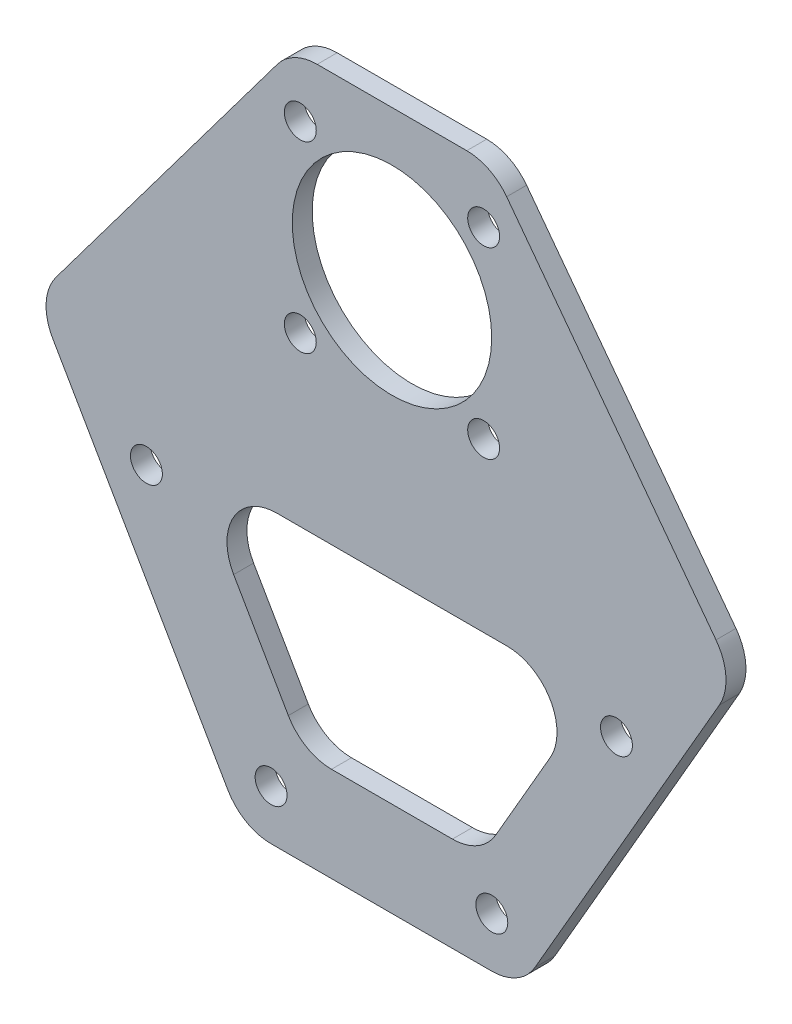
ISO-10303-21;
HEADER;
FILE_DESCRIPTION(('STEP AP214'),'2;1');
FILE_NAME('part.step','',(''),(''),'','','');
FILE_SCHEMA(('AUTOMOTIVE_DESIGN { 1 0 10303 214 1 1 1 1 }'));
ENDSEC;
DATA;
#1=APPLICATION_CONTEXT('core data for automotive mechanical design processes');
#2=APPLICATION_PROTOCOL_DEFINITION('international standard','automotive_design',2000,#1);
#3=PRODUCT_CONTEXT('',#1,'mechanical');
#4=PRODUCT('Part','Part','',(#3));
#5=PRODUCT_RELATED_PRODUCT_CATEGORY('part','',(#4));
#6=PRODUCT_DEFINITION_FORMATION('','',#4);
#7=PRODUCT_DEFINITION_CONTEXT('part definition',#1,'design');
#8=PRODUCT_DEFINITION('design','',#6,#7);
#9=PRODUCT_DEFINITION_SHAPE('','',#8);
#10=(LENGTH_UNIT() NAMED_UNIT(*) SI_UNIT(.MILLI.,.METRE.));
#11=(NAMED_UNIT(*) PLANE_ANGLE_UNIT() SI_UNIT($,.RADIAN.));
#12=(NAMED_UNIT(*) SI_UNIT($,.STERADIAN.) SOLID_ANGLE_UNIT());
#13=UNCERTAINTY_MEASURE_WITH_UNIT(LENGTH_MEASURE(1.E-05),#10,'distance_accuracy_value','');
#14=(GEOMETRIC_REPRESENTATION_CONTEXT(3) GLOBAL_UNCERTAINTY_ASSIGNED_CONTEXT((#13)) GLOBAL_UNIT_ASSIGNED_CONTEXT((#10,
#11,#12)) REPRESENTATION_CONTEXT('',''));
#15=CARTESIAN_POINT('',(0.,0.,0.));
#16=DIRECTION('',(0.,0.,1.));
#17=DIRECTION('',(1.,0.,0.));
#18=AXIS2_PLACEMENT_3D('',#15,#16,#17);
#19=CARTESIAN_POINT('',(24.828838324867,-14.3349364905276,2.));
#20=DIRECTION('',(0.866025403784439,-0.5,0.));
#21=DIRECTION('',(0.5,0.866025403784439,0.));
#22=AXIS2_PLACEMENT_3D('',#19,#20,#21);
#23=PLANE('',#22);
#24=DIRECTION('',(-0.5,-0.866025403784439,0.));
#25=VECTOR('',#24,1.);
#26=CARTESIAN_POINT('',(24.828838324867,-14.3349364905276,2.));
#27=LINE('',#26,#25);
#28=CARTESIAN_POINT('',(32.8223948546932,-0.489690447694644,2.));
#29=VERTEX_POINT('',#28);
#30=CARTESIAN_POINT('',(14.3412340178265,-32.5,2.));
#31=VERTEX_POINT('',#30);
#32=EDGE_CURVE('E245',#29,#31,#27,.T.);
#33=ORIENTED_EDGE('',*,*,#32,.T.);
#34=DIRECTION('',(0.,0.,-1.));
#35=VECTOR('',#34,1.);
#36=CARTESIAN_POINT('',(14.3412340178265,-32.5,0.));
#37=LINE('',#36,#35);
#38=CARTESIAN_POINT('',(14.3412340178265,-32.5,0.));
#39=VERTEX_POINT('',#38);
#40=EDGE_CURVE('E374',#31,#39,#37,.T.);
#41=ORIENTED_EDGE('',*,*,#40,.T.);
#42=DIRECTION('',(-0.5,-0.866025403784439,0.));
#43=VECTOR('',#42,1.);
#44=CARTESIAN_POINT('',(24.828838324867,-14.3349364905276,0.));
#45=LINE('',#44,#43);
#46=CARTESIAN_POINT('',(32.8223948546932,-0.489690447694644,0.));
#47=VERTEX_POINT('',#46);
#48=EDGE_CURVE('E311',#47,#39,#45,.T.);
#49=ORIENTED_EDGE('',*,*,#48,.F.);
#50=DIRECTION('',(0.,0.,-1.));
#51=VECTOR('',#50,1.);
#52=CARTESIAN_POINT('',(32.8223948546932,-0.48969044769465,2.));
#53=LINE('',#52,#51);
#54=EDGE_CURVE('E372',#47,#29,#53,.F.);
#55=ORIENTED_EDGE('',*,*,#54,.T.);
#56=EDGE_LOOP('',(#33,#41,#49,#55));
#57=FACE_BOUND('',#56,.T.);
#58=ADVANCED_FACE('F36',(#57),#23,.T.);
#59=CARTESIAN_POINT('',(23.2,17.4,2.));
#60=DIRECTION('',(0.8,0.6,0.));
#61=DIRECTION('',(-0.6,0.8,0.));
#62=AXIS2_PLACEMENT_3D('',#59,#60,#61);
#63=PLANE('',#62);
#64=DIRECTION('',(0.6,-0.8,0.));
#65=VECTOR('',#64,1.);
#66=CARTESIAN_POINT('',(23.2,17.4,2.));
#67=LINE('',#66,#65);
#68=CARTESIAN_POINT('',(11.5,33.,2.));
#69=VERTEX_POINT('',#68);
#70=CARTESIAN_POINT('',(32.492267835771,5.01030955230535,2.));
#71=VERTEX_POINT('',#70);
#72=EDGE_CURVE('E248',#69,#71,#67,.T.);
#73=ORIENTED_EDGE('',*,*,#72,.T.);
#74=DIRECTION('',(0.,0.,-1.));
#75=VECTOR('',#74,1.);
#76=CARTESIAN_POINT('',(32.492267835771,5.01030955230535,2.));
#77=LINE('',#76,#75);
#78=CARTESIAN_POINT('',(32.492267835771,5.01030955230535,0.));
#79=VERTEX_POINT('',#78);
#80=EDGE_CURVE('E379',#71,#79,#77,.T.);
#81=ORIENTED_EDGE('',*,*,#80,.T.);
#82=DIRECTION('',(0.6,-0.8,0.));
#83=VECTOR('',#82,1.);
#84=CARTESIAN_POINT('',(23.2,17.4,0.));
#85=LINE('',#84,#83);
#86=CARTESIAN_POINT('',(11.5,33.,0.));
#87=VERTEX_POINT('',#86);
#88=EDGE_CURVE('E314',#87,#79,#85,.T.);
#89=ORIENTED_EDGE('',*,*,#88,.F.);
#90=DIRECTION('',(0.,0.,-1.));
#91=VECTOR('',#90,1.);
#92=CARTESIAN_POINT('',(11.5,33.,2.));
#93=LINE('',#92,#91);
#94=EDGE_CURVE('E377',#87,#69,#93,.F.);
#95=ORIENTED_EDGE('',*,*,#94,.T.);
#96=EDGE_LOOP('',(#73,#81,#89,#95));
#97=FACE_BOUND('',#96,.T.);
#98=ADVANCED_FACE('F430',(#97),#63,.T.);
#99=CARTESIAN_POINT('',(0.,35.,2.));
#100=DIRECTION('',(0.,1.,0.));
#101=DIRECTION('',(0.,0.,1.));
#102=AXIS2_PLACEMENT_3D('',#99,#100,#101);
#103=PLANE('',#102);
#104=DIRECTION('',(1.,0.,0.));
#105=VECTOR('',#104,1.);
#106=CARTESIAN_POINT('',(0.,35.,2.));
#107=LINE('',#106,#105);
#108=CARTESIAN_POINT('',(-7.50000000000001,35.,2.));
#109=VERTEX_POINT('',#108);
#110=CARTESIAN_POINT('',(7.5,35.,2.));
#111=VERTEX_POINT('',#110);
#112=EDGE_CURVE('E251',#109,#111,#107,.T.);
#113=ORIENTED_EDGE('',*,*,#112,.T.);
#114=DIRECTION('',(0.,0.,-1.));
#115=VECTOR('',#114,1.);
#116=CARTESIAN_POINT('',(7.5,35.,2.));
#117=LINE('',#116,#115);
#118=CARTESIAN_POINT('',(7.5,35.,0.));
#119=VERTEX_POINT('',#118);
#120=EDGE_CURVE('E384',#111,#119,#117,.T.);
#121=ORIENTED_EDGE('',*,*,#120,.T.);
#122=DIRECTION('',(1.,0.,0.));
#123=VECTOR('',#122,1.);
#124=CARTESIAN_POINT('',(0.,35.,0.));
#125=LINE('',#124,#123);
#126=CARTESIAN_POINT('',(-7.50000000000001,35.,0.));
#127=VERTEX_POINT('',#126);
#128=EDGE_CURVE('E317',#127,#119,#125,.T.);
#129=ORIENTED_EDGE('',*,*,#128,.F.);
#130=DIRECTION('',(0.,0.,-1.));
#131=VECTOR('',#130,1.);
#132=CARTESIAN_POINT('',(-7.50000000000001,35.,2.));
#133=LINE('',#132,#131);
#134=EDGE_CURVE('E382',#127,#109,#133,.F.);
#135=ORIENTED_EDGE('',*,*,#134,.T.);
#136=EDGE_LOOP('',(#113,#121,#129,#135));
#137=FACE_BOUND('',#136,.T.);
#138=ADVANCED_FACE('F389',(#137),#103,.T.);
#139=CARTESIAN_POINT('',(-23.2,17.4,2.));
#140=DIRECTION('',(-0.8,0.6,0.));
#141=DIRECTION('',(-0.6,-0.8,0.));
#142=AXIS2_PLACEMENT_3D('',#139,#140,#141);
#143=PLANE('',#142);
#144=DIRECTION('',(0.6,0.8,0.));
#145=VECTOR('',#144,1.);
#146=CARTESIAN_POINT('',(-23.2,17.4,2.));
#147=LINE('',#146,#145);
#148=CARTESIAN_POINT('',(-33.6863283090029,3.4182289213295,2.));
#149=VERTEX_POINT('',#148);
#150=CARTESIAN_POINT('',(-11.5,33.,2.));
#151=VERTEX_POINT('',#150);
#152=EDGE_CURVE('E254',#149,#151,#147,.T.);
#153=ORIENTED_EDGE('',*,*,#152,.T.);
#154=DIRECTION('',(0.,0.,-1.));
#155=VECTOR('',#154,1.);
#156=CARTESIAN_POINT('',(-11.5,33.,2.));
#157=LINE('',#156,#155);
#158=CARTESIAN_POINT('',(-11.5,33.,0.));
#159=VERTEX_POINT('',#158);
#160=EDGE_CURVE('E11',#151,#159,#157,.T.);
#161=ORIENTED_EDGE('',*,*,#160,.T.);
#162=DIRECTION('',(0.6,0.8,0.));
#163=VECTOR('',#162,1.);
#164=CARTESIAN_POINT('',(-23.2,17.4,0.));
#165=LINE('',#164,#163);
#166=CARTESIAN_POINT('',(-33.6863283090029,3.4182289213295,0.));
#167=VERTEX_POINT('',#166);
#168=EDGE_CURVE('E320',#167,#159,#165,.T.);
#169=ORIENTED_EDGE('',*,*,#168,.F.);
#170=DIRECTION('',(0.,0.,-1.));
#171=VECTOR('',#170,1.);
#172=CARTESIAN_POINT('',(-33.6863283090029,3.4182289213295,2.));
#173=LINE('',#172,#171);
#174=EDGE_CURVE('E44',#167,#149,#173,.F.);
#175=ORIENTED_EDGE('',*,*,#174,.T.);
#176=EDGE_LOOP('',(#153,#161,#169,#175));
#177=FACE_BOUND('',#176,.T.);
#178=ADVANCED_FACE('F400',(#177),#143,.T.);
#179=CARTESIAN_POINT('',(-26.4137748154416,-15.2500000000074,2.));
#180=DIRECTION('',(-0.866025403784467,-0.499999999999951,0.));
#181=DIRECTION('',(0.499999999999951,-0.866025403784467,0.));
#182=AXIS2_PLACEMENT_3D('',#179,#180,#181);
#183=PLANE('',#182);
#184=DIRECTION('',(-0.499999999999951,0.866025403784467,0.));
#185=VECTOR('',#184,1.);
#186=CARTESIAN_POINT('',(-26.4137748154416,-15.2500000000074,0.));
#187=LINE('',#186,#185);
#188=CARTESIAN_POINT('',(-16.4544826719262,-32.4999999999998,0.));
#189=VERTEX_POINT('',#188);
#190=CARTESIAN_POINT('',(-34.0164553279252,-2.08177107867025,0.));
#191=VERTEX_POINT('',#190);
#192=EDGE_CURVE('E323',#189,#191,#187,.T.);
#193=ORIENTED_EDGE('',*,*,#192,.F.);
#194=DIRECTION('',(0.,0.,-1.));
#195=VECTOR('',#194,1.);
#196=CARTESIAN_POINT('',(-16.4544826719262,-32.4999999999998,2.));
#197=LINE('',#196,#195);
#198=CARTESIAN_POINT('',(-16.4544826719262,-32.4999999999998,2.));
#199=VERTEX_POINT('',#198);
#200=EDGE_CURVE('E359',#189,#199,#197,.F.);
#201=ORIENTED_EDGE('',*,*,#200,.T.);
#202=DIRECTION('',(-0.499999999999951,0.866025403784467,0.));
#203=VECTOR('',#202,1.);
#204=CARTESIAN_POINT('',(-26.4137748154416,-15.2500000000074,2.));
#205=LINE('',#204,#203);
#206=CARTESIAN_POINT('',(-34.0164553279252,-2.08177107867025,2.));
#207=VERTEX_POINT('',#206);
#208=EDGE_CURVE('E256',#199,#207,#205,.T.);
#209=ORIENTED_EDGE('',*,*,#208,.T.);
#210=DIRECTION('',(0.,0.,-1.));
#211=VECTOR('',#210,1.);
#212=CARTESIAN_POINT('',(-34.0164553279252,-2.08177107867025,2.));
#213=LINE('',#212,#211);
#214=EDGE_CURVE('E356',#207,#191,#213,.T.);
#215=ORIENTED_EDGE('',*,*,#214,.T.);
#216=EDGE_LOOP('',(#193,#201,#209,#215));
#217=FACE_BOUND('',#216,.T.);
#218=ADVANCED_FACE('F407',(#217),#183,.T.);
#219=CARTESIAN_POINT('',(-6.06217782649132,-20.5000000000001,2.));
#220=DIRECTION('',(0.,0.,-1.));
#221=DIRECTION('',(-1.,0.,0.));
#222=AXIS2_PLACEMENT_3D('',#219,#220,#221);
#223=CYLINDRICAL_SURFACE('',#222,5.);
#224=CARTESIAN_POINT('',(-6.06217782649132,-20.5000000000001,0.));
#225=DIRECTION('',(0.,0.,1.));
#226=DIRECTION('',(1.,0.,0.));
#227=AXIS2_PLACEMENT_3D('',#224,#225,#226);
#228=CIRCLE('',#227,5.);
#229=CARTESIAN_POINT('',(-10.3923048454135,-23.0000000000001,0.));
#230=VERTEX_POINT('',#229);
#231=CARTESIAN_POINT('',(-6.06217782649133,-25.5000000000001,0.));
#232=VERTEX_POINT('',#231);
#233=EDGE_CURVE('E180',#230,#232,#228,.T.);
#234=ORIENTED_EDGE('',*,*,#233,.F.);
#235=DIRECTION('',(0.,0.,-1.));
#236=VECTOR('',#235,1.);
#237=CARTESIAN_POINT('',(-10.3923048454135,-23.0000000000001,2.));
#238=LINE('',#237,#236);
#239=CARTESIAN_POINT('',(-10.3923048454135,-23.0000000000001,2.));
#240=VERTEX_POINT('',#239);
#241=EDGE_CURVE('E174',#240,#230,#238,.T.);
#242=ORIENTED_EDGE('',*,*,#241,.F.);
#243=CARTESIAN_POINT('',(-6.06217782649132,-20.5000000000001,2.));
#244=DIRECTION('',(0.,0.,1.));
#245=DIRECTION('',(1.,0.,0.));
#246=AXIS2_PLACEMENT_3D('',#243,#244,#245);
#247=CIRCLE('',#246,5.);
#248=CARTESIAN_POINT('',(-6.06217782649133,-25.5000000000001,2.));
#249=VERTEX_POINT('',#248);
#250=EDGE_CURVE('E177',#240,#249,#247,.T.);
#251=ORIENTED_EDGE('',*,*,#250,.T.);
#252=DIRECTION('',(0.,0.,-1.));
#253=VECTOR('',#252,1.);
#254=CARTESIAN_POINT('',(-6.06217782649133,-25.5000000000001,2.));
#255=LINE('',#254,#253);
#256=EDGE_CURVE('E262',#249,#232,#255,.T.);
#257=ORIENTED_EDGE('',*,*,#256,.T.);
#258=EDGE_LOOP('',(#234,#242,#251,#257));
#259=FACE_BOUND('',#258,.T.);
#260=ADVANCED_FACE('F176',(#259),#223,.F.);
#261=CARTESIAN_POINT('',(-17.7535207775812,-10.2500000000001,2.));
#262=DIRECTION('',(0.86602540378444,0.499999999999998,0.));
#263=DIRECTION('',(-0.499999999999998,0.86602540378444,0.));
#264=AXIS2_PLACEMENT_3D('',#261,#262,#263);
#265=PLANE('',#264);
#266=DIRECTION('',(0.499999999999998,-0.86602540378444,0.));
#267=VECTOR('',#266,1.);
#268=CARTESIAN_POINT('',(-17.7535207775812,-10.2500000000001,0.));
#269=LINE('',#268,#267);
#270=CARTESIAN_POINT('',(-15.8771324027149,-13.5000000000001,0.));
#271=VERTEX_POINT('',#270);
#272=EDGE_CURVE('E264',#271,#230,#269,.T.);
#273=ORIENTED_EDGE('',*,*,#272,.F.);
#274=DIRECTION('',(0.,0.,-1.));
#275=VECTOR('',#274,1.);
#276=CARTESIAN_POINT('',(-15.8771324027149,-13.5000000000001,2.));
#277=LINE('',#276,#275);
#278=CARTESIAN_POINT('',(-15.8771324027149,-13.5000000000001,2.));
#279=VERTEX_POINT('',#278);
#280=EDGE_CURVE('E186',#279,#271,#277,.T.);
#281=ORIENTED_EDGE('',*,*,#280,.F.);
#282=DIRECTION('',(0.499999999999998,-0.86602540378444,0.));
#283=VECTOR('',#282,1.);
#284=CARTESIAN_POINT('',(-17.7535207775812,-10.2500000000001,2.));
#285=LINE('',#284,#283);
#286=EDGE_CURVE('E193',#279,#240,#285,.T.);
#287=ORIENTED_EDGE('',*,*,#286,.T.);
#288=ORIENTED_EDGE('',*,*,#241,.T.);
#289=EDGE_LOOP('',(#273,#281,#287,#288));
#290=FACE_BOUND('',#289,.T.);
#291=ADVANCED_FACE('F200',(#290),#265,.T.);
#292=CARTESIAN_POINT('',(-11.5470053837927,-11.0000000000001,2.));
#293=DIRECTION('',(0.,0.,-1.));
#294=DIRECTION('',(-1.,0.,0.));
#295=AXIS2_PLACEMENT_3D('',#292,#293,#294);
#296=CYLINDRICAL_SURFACE('',#295,5.);
#297=CARTESIAN_POINT('',(-11.5470053837927,-11.0000000000001,0.));
#298=DIRECTION('',(0.,0.,1.));
#299=DIRECTION('',(1.,0.,0.));
#300=AXIS2_PLACEMENT_3D('',#297,#298,#299);
#301=CIRCLE('',#300,5.);
#302=CARTESIAN_POINT('',(-11.5470053837927,-6.00000000000013,0.));
#303=VERTEX_POINT('',#302);
#304=EDGE_CURVE('E266',#303,#271,#301,.T.);
#305=ORIENTED_EDGE('',*,*,#304,.F.);
#306=DIRECTION('',(0.,0.,-1.));
#307=VECTOR('',#306,1.);
#308=CARTESIAN_POINT('',(-11.5470053837927,-6.00000000000013,2.));
#309=LINE('',#308,#307);
#310=CARTESIAN_POINT('',(-11.5470053837927,-6.00000000000013,2.));
#311=VERTEX_POINT('',#310);
#312=EDGE_CURVE('E337',#311,#303,#309,.T.);
#313=ORIENTED_EDGE('',*,*,#312,.F.);
#314=CARTESIAN_POINT('',(-11.5470053837927,-11.0000000000001,2.));
#315=DIRECTION('',(0.,0.,1.));
#316=DIRECTION('',(1.,0.,0.));
#317=AXIS2_PLACEMENT_3D('',#314,#315,#316);
#318=CIRCLE('',#317,5.);
#319=EDGE_CURVE('E201',#311,#279,#318,.T.);
#320=ORIENTED_EDGE('',*,*,#319,.T.);
#321=ORIENTED_EDGE('',*,*,#280,.T.);
#322=EDGE_LOOP('',(#305,#313,#320,#321));
#323=FACE_BOUND('',#322,.T.);
#324=ADVANCED_FACE('F504',(#323),#296,.F.);
#325=CARTESIAN_POINT('',(0.,-6.00000000000016,2.));
#326=DIRECTION('',(0.,-1.,0.));
#327=DIRECTION('',(1.,0.,0.));
#328=AXIS2_PLACEMENT_3D('',#325,#326,#327);
#329=PLANE('',#328);
#330=DIRECTION('',(-1.,0.,0.));
#331=VECTOR('',#330,1.);
#332=CARTESIAN_POINT('',(0.,-6.00000000000016,0.));
#333=LINE('',#332,#331);
#334=CARTESIAN_POINT('',(11.5470053837923,-6.00000000000018,0.));
#335=VERTEX_POINT('',#334);
#336=EDGE_CURVE('E269',#335,#303,#333,.T.);
#337=ORIENTED_EDGE('',*,*,#336,.F.);
#338=DIRECTION('',(0.,0.,-1.));
#339=VECTOR('',#338,1.);
#340=CARTESIAN_POINT('',(11.5470053837923,-6.00000000000018,2.));
#341=LINE('',#340,#339);
#342=CARTESIAN_POINT('',(11.5470053837923,-6.00000000000018,2.));
#343=VERTEX_POINT('',#342);
#344=EDGE_CURVE('E335',#343,#335,#341,.T.);
#345=ORIENTED_EDGE('',*,*,#344,.F.);
#346=DIRECTION('',(-1.,0.,0.));
#347=VECTOR('',#346,1.);
#348=CARTESIAN_POINT('',(0.,-6.00000000000016,2.));
#349=LINE('',#348,#347);
#350=EDGE_CURVE('E203',#343,#311,#349,.T.);
#351=ORIENTED_EDGE('',*,*,#350,.T.);
#352=ORIENTED_EDGE('',*,*,#312,.T.);
#353=EDGE_LOOP('',(#337,#345,#351,#352));
#354=FACE_BOUND('',#353,.T.);
#355=ADVANCED_FACE('F500',(#354),#329,.T.);
#356=CARTESIAN_POINT('',(11.5470053837923,-11.0000000000002,2.));
#357=DIRECTION('',(0.,0.,-1.));
#358=DIRECTION('',(-1.,0.,0.));
#359=AXIS2_PLACEMENT_3D('',#356,#357,#358);
#360=CYLINDRICAL_SURFACE('',#359,5.);
#361=CARTESIAN_POINT('',(11.5470053837923,-11.0000000000002,0.));
#362=DIRECTION('',(0.,0.,1.));
#363=DIRECTION('',(1.,0.,0.));
#364=AXIS2_PLACEMENT_3D('',#361,#362,#363);
#365=CIRCLE('',#364,5.);
#366=CARTESIAN_POINT('',(15.8771324027145,-13.5000000000002,0.));
#367=VERTEX_POINT('',#366);
#368=EDGE_CURVE('E272',#367,#335,#365,.T.);
#369=ORIENTED_EDGE('',*,*,#368,.F.);
#370=DIRECTION('',(0.,0.,-1.));
#371=VECTOR('',#370,1.);
#372=CARTESIAN_POINT('',(15.8771324027145,-13.5000000000002,2.));
#373=LINE('',#372,#371);
#374=CARTESIAN_POINT('',(15.8771324027145,-13.5000000000002,2.));
#375=VERTEX_POINT('',#374);
#376=EDGE_CURVE('E333',#375,#367,#373,.T.);
#377=ORIENTED_EDGE('',*,*,#376,.F.);
#378=CARTESIAN_POINT('',(11.5470053837923,-11.0000000000002,2.));
#379=DIRECTION('',(0.,0.,1.));
#380=DIRECTION('',(1.,0.,0.));
#381=AXIS2_PLACEMENT_3D('',#378,#379,#380);
#382=CIRCLE('',#381,5.);
#383=EDGE_CURVE('E208',#375,#343,#382,.T.);
#384=ORIENTED_EDGE('',*,*,#383,.T.);
#385=ORIENTED_EDGE('',*,*,#344,.T.);
#386=EDGE_LOOP('',(#369,#377,#384,#385));
#387=FACE_BOUND('',#386,.T.);
#388=ADVANCED_FACE('F496',(#387),#360,.F.);
#389=CARTESIAN_POINT('',(17.7535207775809,-10.25,2.));
#390=DIRECTION('',(-0.866025403784438,0.500000000000002,0.));
#391=DIRECTION('',(-0.500000000000002,-0.866025403784438,0.));
#392=AXIS2_PLACEMENT_3D('',#389,#390,#391);
#393=PLANE('',#392);
#394=DIRECTION('',(0.500000000000002,0.866025403784438,0.));
#395=VECTOR('',#394,1.);
#396=CARTESIAN_POINT('',(17.7535207775809,-10.25,0.));
#397=LINE('',#396,#395);
#398=CARTESIAN_POINT('',(10.392304845413,-23.0000000000002,0.));
#399=VERTEX_POINT('',#398);
#400=EDGE_CURVE('E275',#399,#367,#397,.T.);
#401=ORIENTED_EDGE('',*,*,#400,.F.);
#402=DIRECTION('',(0.,0.,-1.));
#403=VECTOR('',#402,1.);
#404=CARTESIAN_POINT('',(10.392304845413,-23.0000000000002,2.));
#405=LINE('',#404,#403);
#406=CARTESIAN_POINT('',(10.392304845413,-23.0000000000002,2.));
#407=VERTEX_POINT('',#406);
#408=EDGE_CURVE('E331',#407,#399,#405,.T.);
#409=ORIENTED_EDGE('',*,*,#408,.F.);
#410=DIRECTION('',(0.500000000000002,0.866025403784438,0.));
#411=VECTOR('',#410,1.);
#412=CARTESIAN_POINT('',(17.7535207775809,-10.25,2.));
#413=LINE('',#412,#411);
#414=EDGE_CURVE('E211',#407,#375,#413,.T.);
#415=ORIENTED_EDGE('',*,*,#414,.T.);
#416=ORIENTED_EDGE('',*,*,#376,.T.);
#417=EDGE_LOOP('',(#401,#409,#415,#416));
#418=FACE_BOUND('',#417,.T.);
#419=ADVANCED_FACE('F492',(#418),#393,.T.);
#420=CARTESIAN_POINT('',(6.06217782649083,-20.5000000000002,2.));
#421=DIRECTION('',(0.,0.,-1.));
#422=DIRECTION('',(-1.,0.,0.));
#423=AXIS2_PLACEMENT_3D('',#420,#421,#422);
#424=CYLINDRICAL_SURFACE('',#423,5.);
#425=CARTESIAN_POINT('',(6.06217782649083,-20.5000000000002,0.));
#426=DIRECTION('',(0.,0.,1.));
#427=DIRECTION('',(1.,0.,0.));
#428=AXIS2_PLACEMENT_3D('',#425,#426,#427);
#429=CIRCLE('',#428,5.);
#430=CARTESIAN_POINT('',(6.06217782649082,-25.5000000000002,0.));
#431=VERTEX_POINT('',#430);
#432=EDGE_CURVE('E278',#431,#399,#429,.T.);
#433=ORIENTED_EDGE('',*,*,#432,.F.);
#434=DIRECTION('',(0.,0.,-1.));
#435=VECTOR('',#434,1.);
#436=CARTESIAN_POINT('',(6.06217782649082,-25.5000000000002,2.));
#437=LINE('',#436,#435);
#438=CARTESIAN_POINT('',(6.06217782649082,-25.5000000000002,2.));
#439=VERTEX_POINT('',#438);
#440=EDGE_CURVE('E329',#439,#431,#437,.T.);
#441=ORIENTED_EDGE('',*,*,#440,.F.);
#442=CARTESIAN_POINT('',(6.06217782649083,-20.5000000000002,2.));
#443=DIRECTION('',(0.,0.,1.));
#444=DIRECTION('',(1.,0.,0.));
#445=AXIS2_PLACEMENT_3D('',#442,#443,#444);
#446=CIRCLE('',#445,5.);
#447=EDGE_CURVE('E214',#439,#407,#446,.T.);
#448=ORIENTED_EDGE('',*,*,#447,.T.);
#449=ORIENTED_EDGE('',*,*,#408,.T.);
#450=EDGE_LOOP('',(#433,#441,#448,#449));
#451=FACE_BOUND('',#450,.T.);
#452=ADVANCED_FACE('F453',(#451),#424,.F.);
#453=CARTESIAN_POINT('',(0.,20.,2.));
#454=DIRECTION('',(0.,0.,-1.));
#455=DIRECTION('',(-1.,0.,0.));
#456=AXIS2_PLACEMENT_3D('',#453,#454,#455);
#457=CYLINDRICAL_SURFACE('',#456,10.);
#458=CARTESIAN_POINT('',(0.,20.,2.));
#459=DIRECTION('',(0.,0.,1.));
#460=DIRECTION('',(1.,0.,0.));
#461=AXIS2_PLACEMENT_3D('',#458,#459,#460);
#462=CIRCLE('',#461,10.);
#463=CARTESIAN_POINT('',(10.,20.,2.));
#464=VERTEX_POINT('',#463);
#465=EDGE_CURVE('E242',#464,#464,#462,.T.);
#466=ORIENTED_EDGE('',*,*,#465,.T.);
#467=EDGE_LOOP('',(#466));
#468=FACE_BOUND('',#467,.T.);
#469=CARTESIAN_POINT('',(0.,20.,0.));
#470=DIRECTION('',(0.,0.,1.));
#471=DIRECTION('',(1.,0.,0.));
#472=AXIS2_PLACEMENT_3D('',#469,#470,#471);
#473=CIRCLE('',#472,10.);
#474=CARTESIAN_POINT('',(10.,20.,0.));
#475=VERTEX_POINT('',#474);
#476=EDGE_CURVE('E308',#475,#475,#473,.T.);
#477=ORIENTED_EDGE('',*,*,#476,.F.);
#478=EDGE_LOOP('',(#477));
#479=FACE_BOUND('',#478,.T.);
#480=ADVANCED_FACE('F449',(#468,#479),#457,.F.);
#481=CARTESIAN_POINT('',(-9.19238815542512,29.1923881554251,2.));
#482=DIRECTION('',(0.,0.,-1.));
#483=DIRECTION('',(-1.,0.,0.));
#484=AXIS2_PLACEMENT_3D('',#481,#482,#483);
#485=CYLINDRICAL_SURFACE('',#484,1.6);
#486=CARTESIAN_POINT('',(-9.19238815542512,29.1923881554251,2.));
#487=DIRECTION('',(0.,0.,1.));
#488=DIRECTION('',(1.,0.,0.));
#489=AXIS2_PLACEMENT_3D('',#486,#487,#488);
#490=CIRCLE('',#489,1.6);
#491=CARTESIAN_POINT('',(-7.59238815542512,29.1923881554251,2.));
#492=VERTEX_POINT('',#491);
#493=EDGE_CURVE('E239',#492,#492,#490,.T.);
#494=ORIENTED_EDGE('',*,*,#493,.T.);
#495=EDGE_LOOP('',(#494));
#496=FACE_BOUND('',#495,.T.);
#497=CARTESIAN_POINT('',(-9.19238815542512,29.1923881554251,0.));
#498=DIRECTION('',(0.,0.,1.));
#499=DIRECTION('',(1.,0.,0.));
#500=AXIS2_PLACEMENT_3D('',#497,#498,#499);
#501=CIRCLE('',#500,1.6);
#502=CARTESIAN_POINT('',(-7.59238815542512,29.1923881554251,0.));
#503=VERTEX_POINT('',#502);
#504=EDGE_CURVE('E305',#503,#503,#501,.T.);
#505=ORIENTED_EDGE('',*,*,#504,.F.);
#506=EDGE_LOOP('',(#505));
#507=FACE_BOUND('',#506,.T.);
#508=ADVANCED_FACE('F452',(#496,#507),#485,.F.);
#509=CARTESIAN_POINT('',(9.19238815542511,29.1923881554251,2.));
#510=DIRECTION('',(0.,0.,-1.));
#511=DIRECTION('',(-1.,0.,0.));
#512=AXIS2_PLACEMENT_3D('',#509,#510,#511);
#513=CYLINDRICAL_SURFACE('',#512,1.6);
#514=CARTESIAN_POINT('',(9.19238815542511,29.1923881554251,2.));
#515=DIRECTION('',(0.,0.,1.));
#516=DIRECTION('',(1.,0.,0.));
#517=AXIS2_PLACEMENT_3D('',#514,#515,#516);
#518=CIRCLE('',#517,1.6);
#519=CARTESIAN_POINT('',(10.7923881554251,29.1923881554251,2.));
#520=VERTEX_POINT('',#519);
#521=EDGE_CURVE('E236',#520,#520,#518,.T.);
#522=ORIENTED_EDGE('',*,*,#521,.T.);
#523=EDGE_LOOP('',(#522));
#524=FACE_BOUND('',#523,.T.);
#525=CARTESIAN_POINT('',(9.19238815542511,29.1923881554251,0.));
#526=DIRECTION('',(0.,0.,1.));
#527=DIRECTION('',(1.,0.,0.));
#528=AXIS2_PLACEMENT_3D('',#525,#526,#527);
#529=CIRCLE('',#528,1.6);
#530=CARTESIAN_POINT('',(10.7923881554251,29.1923881554251,0.));
#531=VERTEX_POINT('',#530);
#532=EDGE_CURVE('E302',#531,#531,#529,.T.);
#533=ORIENTED_EDGE('',*,*,#532,.F.);
#534=EDGE_LOOP('',(#533));
#535=FACE_BOUND('',#534,.T.);
#536=ADVANCED_FACE('F457',(#524,#535),#513,.F.);
#537=CARTESIAN_POINT('',(-9.19238815542512,10.8076118445749,2.));
#538=DIRECTION('',(0.,0.,-1.));
#539=DIRECTION('',(-1.,0.,0.));
#540=AXIS2_PLACEMENT_3D('',#537,#538,#539);
#541=CYLINDRICAL_SURFACE('',#540,1.6);
#542=CARTESIAN_POINT('',(-9.19238815542512,10.8076118445749,2.));
#543=DIRECTION('',(0.,0.,1.));
#544=DIRECTION('',(1.,0.,0.));
#545=AXIS2_PLACEMENT_3D('',#542,#543,#544);
#546=CIRCLE('',#545,1.6);
#547=CARTESIAN_POINT('',(-7.59238815542512,10.8076118445749,2.));
#548=VERTEX_POINT('',#547);
#549=EDGE_CURVE('E233',#548,#548,#546,.T.);
#550=ORIENTED_EDGE('',*,*,#549,.T.);
#551=EDGE_LOOP('',(#550));
#552=FACE_BOUND('',#551,.T.);
#553=CARTESIAN_POINT('',(-9.19238815542512,10.8076118445749,0.));
#554=DIRECTION('',(0.,0.,1.));
#555=DIRECTION('',(1.,0.,0.));
#556=AXIS2_PLACEMENT_3D('',#553,#554,#555);
#557=CIRCLE('',#556,1.6);
#558=CARTESIAN_POINT('',(-7.59238815542512,10.8076118445749,0.));
#559=VERTEX_POINT('',#558);
#560=EDGE_CURVE('E299',#559,#559,#557,.T.);
#561=ORIENTED_EDGE('',*,*,#560,.F.);
#562=EDGE_LOOP('',(#561));
#563=FACE_BOUND('',#562,.T.);
#564=ADVANCED_FACE('F461',(#552,#563),#541,.F.);
#565=CARTESIAN_POINT('',(9.19238815542512,10.8076118445749,2.));
#566=DIRECTION('',(0.,0.,-1.));
#567=DIRECTION('',(-1.,0.,0.));
#568=AXIS2_PLACEMENT_3D('',#565,#566,#567);
#569=CYLINDRICAL_SURFACE('',#568,1.6);
#570=CARTESIAN_POINT('',(9.19238815542512,10.8076118445749,2.));
#571=DIRECTION('',(0.,0.,1.));
#572=DIRECTION('',(1.,0.,0.));
#573=AXIS2_PLACEMENT_3D('',#570,#571,#572);
#574=CIRCLE('',#573,1.6);
#575=CARTESIAN_POINT('',(10.7923881554251,10.8076118445749,2.));
#576=VERTEX_POINT('',#575);
#577=EDGE_CURVE('E230',#576,#576,#574,.T.);
#578=ORIENTED_EDGE('',*,*,#577,.T.);
#579=EDGE_LOOP('',(#578));
#580=FACE_BOUND('',#579,.T.);
#581=CARTESIAN_POINT('',(9.19238815542512,10.8076118445749,0.));
#582=DIRECTION('',(0.,0.,1.));
#583=DIRECTION('',(1.,0.,0.));
#584=AXIS2_PLACEMENT_3D('',#581,#582,#583);
#585=CIRCLE('',#584,1.6);
#586=CARTESIAN_POINT('',(10.7923881554251,10.8076118445749,0.));
#587=VERTEX_POINT('',#586);
#588=EDGE_CURVE('E296',#587,#587,#585,.T.);
#589=ORIENTED_EDGE('',*,*,#588,.F.);
#590=EDGE_LOOP('',(#589));
#591=FACE_BOUND('',#590,.T.);
#592=ADVANCED_FACE('F465',(#580,#591),#569,.F.);
#593=CARTESIAN_POINT('',(-12.1243556530068,-30.,2.));
#594=DIRECTION('',(0.,0.,-1.));
#595=DIRECTION('',(-1.,0.,0.));
#596=AXIS2_PLACEMENT_3D('',#593,#594,#595);
#597=CYLINDRICAL_SURFACE('',#596,1.6);
#598=CARTESIAN_POINT('',(-12.1243556530068,-30.,2.));
#599=DIRECTION('',(0.,0.,1.));
#600=DIRECTION('',(1.,0.,0.));
#601=AXIS2_PLACEMENT_3D('',#598,#599,#600);
#602=CIRCLE('',#601,1.6);
#603=CARTESIAN_POINT('',(-10.5243556530068,-30.,2.));
#604=VERTEX_POINT('',#603);
#605=EDGE_CURVE('E227',#604,#604,#602,.T.);
#606=ORIENTED_EDGE('',*,*,#605,.T.);
#607=EDGE_LOOP('',(#606));
#608=FACE_BOUND('',#607,.T.);
#609=CARTESIAN_POINT('',(-12.1243556530068,-30.,0.));
#610=DIRECTION('',(0.,0.,1.));
#611=DIRECTION('',(1.,0.,0.));
#612=AXIS2_PLACEMENT_3D('',#609,#610,#611);
#613=CIRCLE('',#612,1.6);
#614=CARTESIAN_POINT('',(-10.5243556530068,-30.,0.));
#615=VERTEX_POINT('',#614);
#616=EDGE_CURVE('E293',#615,#615,#613,.T.);
#617=ORIENTED_EDGE('',*,*,#616,.F.);
#618=EDGE_LOOP('',(#617));
#619=FACE_BOUND('',#618,.T.);
#620=ADVANCED_FACE('F469',(#608,#619),#597,.F.);
#621=CARTESIAN_POINT('',(10.0111069989249,-30.,2.));
#622=DIRECTION('',(0.,0.,-1.));
#623=DIRECTION('',(-1.,0.,0.));
#624=AXIS2_PLACEMENT_3D('',#621,#622,#623);
#625=CYLINDRICAL_SURFACE('',#624,1.6);
#626=CARTESIAN_POINT('',(10.0111069989249,-30.,2.));
#627=DIRECTION('',(0.,0.,1.));
#628=DIRECTION('',(1.,0.,0.));
#629=AXIS2_PLACEMENT_3D('',#626,#627,#628);
#630=CIRCLE('',#629,1.6);
#631=CARTESIAN_POINT('',(11.6111069989249,-30.,2.));
#632=VERTEX_POINT('',#631);
#633=EDGE_CURVE('E224',#632,#632,#630,.T.);
#634=ORIENTED_EDGE('',*,*,#633,.T.);
#635=EDGE_LOOP('',(#634));
#636=FACE_BOUND('',#635,.T.);
#637=CARTESIAN_POINT('',(10.0111069989249,-30.,0.));
#638=DIRECTION('',(0.,0.,1.));
#639=DIRECTION('',(1.,0.,0.));
#640=AXIS2_PLACEMENT_3D('',#637,#638,#639);
#641=CIRCLE('',#640,1.6);
#642=CARTESIAN_POINT('',(11.6111069989249,-30.,0.));
#643=VERTEX_POINT('',#642);
#644=EDGE_CURVE('E290',#643,#643,#641,.T.);
#645=ORIENTED_EDGE('',*,*,#644,.F.);
#646=EDGE_LOOP('',(#645));
#647=FACE_BOUND('',#646,.T.);
#648=ADVANCED_FACE('F473',(#636,#647),#625,.F.);
#649=CARTESIAN_POINT('',(-24.6243556530067,-8.34936490538901,2.));
#650=DIRECTION('',(0.,0.,-1.));
#651=DIRECTION('',(-1.,0.,0.));
#652=AXIS2_PLACEMENT_3D('',#649,#650,#651);
#653=CYLINDRICAL_SURFACE('',#652,1.6);
#654=CARTESIAN_POINT('',(-24.6243556530067,-8.34936490538901,2.));
#655=DIRECTION('',(0.,0.,1.));
#656=DIRECTION('',(1.,0.,0.));
#657=AXIS2_PLACEMENT_3D('',#654,#655,#656);
#658=CIRCLE('',#657,1.6);
#659=CARTESIAN_POINT('',(-23.0243556530067,-8.34936490538901,2.));
#660=VERTEX_POINT('',#659);
#661=EDGE_CURVE('E221',#660,#660,#658,.T.);
#662=ORIENTED_EDGE('',*,*,#661,.T.);
#663=EDGE_LOOP('',(#662));
#664=FACE_BOUND('',#663,.T.);
#665=CARTESIAN_POINT('',(-24.6243556530067,-8.34936490538901,0.));
#666=DIRECTION('',(0.,0.,1.));
#667=DIRECTION('',(1.,0.,0.));
#668=AXIS2_PLACEMENT_3D('',#665,#666,#667);
#669=CIRCLE('',#668,1.6);
#670=CARTESIAN_POINT('',(-23.0243556530067,-8.34936490538901,0.));
#671=VERTEX_POINT('',#670);
#672=EDGE_CURVE('E287',#671,#671,#669,.T.);
#673=ORIENTED_EDGE('',*,*,#672,.F.);
#674=EDGE_LOOP('',(#673));
#675=FACE_BOUND('',#674,.T.);
#676=ADVANCED_FACE('F477',(#664,#675),#653,.F.);
#677=CARTESIAN_POINT('',(22.5111069989249,-8.34936490538906,2.));
#678=DIRECTION('',(0.,0.,-1.));
#679=DIRECTION('',(-1.,0.,0.));
#680=AXIS2_PLACEMENT_3D('',#677,#678,#679);
#681=CYLINDRICAL_SURFACE('',#680,1.6);
#682=CARTESIAN_POINT('',(22.5111069989249,-8.34936490538906,2.));
#683=DIRECTION('',(0.,0.,1.));
#684=DIRECTION('',(1.,0.,0.));
#685=AXIS2_PLACEMENT_3D('',#682,#683,#684);
#686=CIRCLE('',#685,1.6);
#687=CARTESIAN_POINT('',(24.1111069989249,-8.34936490538906,2.));
#688=VERTEX_POINT('',#687);
#689=EDGE_CURVE('E218',#688,#688,#686,.T.);
#690=ORIENTED_EDGE('',*,*,#689,.T.);
#691=EDGE_LOOP('',(#690));
#692=FACE_BOUND('',#691,.T.);
#693=CARTESIAN_POINT('',(22.5111069989249,-8.34936490538906,0.));
#694=DIRECTION('',(0.,0.,1.));
#695=DIRECTION('',(1.,0.,0.));
#696=AXIS2_PLACEMENT_3D('',#693,#694,#695);
#697=CIRCLE('',#696,1.6);
#698=CARTESIAN_POINT('',(24.1111069989249,-8.34936490538906,0.));
#699=VERTEX_POINT('',#698);
#700=EDGE_CURVE('E284',#699,#699,#697,.T.);
#701=ORIENTED_EDGE('',*,*,#700,.F.);
#702=EDGE_LOOP('',(#701));
#703=FACE_BOUND('',#702,.T.);
#704=ADVANCED_FACE('F481',(#692,#703),#681,.F.);
#705=CARTESIAN_POINT('',(0.,-25.5000000000002,2.));
#706=DIRECTION('',(0.,1.,0.));
#707=DIRECTION('',(-1.,0.,0.));
#708=AXIS2_PLACEMENT_3D('',#705,#706,#707);
#709=PLANE('',#708);
#710=DIRECTION('',(1.,0.,0.));
#711=VECTOR('',#710,1.);
#712=CARTESIAN_POINT('',(0.,-25.5000000000002,0.));
#713=LINE('',#712,#711);
#714=EDGE_CURVE('E281',#232,#431,#713,.T.);
#715=ORIENTED_EDGE('',*,*,#714,.F.);
#716=ORIENTED_EDGE('',*,*,#256,.F.);
#717=DIRECTION('',(1.,0.,0.));
#718=VECTOR('',#717,1.);
#719=CARTESIAN_POINT('',(0.,-25.5000000000002,2.));
#720=LINE('',#719,#718);
#721=EDGE_CURVE('E197',#249,#439,#720,.T.);
#722=ORIENTED_EDGE('',*,*,#721,.T.);
#723=ORIENTED_EDGE('',*,*,#440,.T.);
#724=EDGE_LOOP('',(#715,#716,#722,#723));
#725=FACE_BOUND('',#724,.T.);
#726=ADVANCED_FACE('F485',(#725),#709,.T.);
#727=CARTESIAN_POINT('',(0.,-35.,2.));
#728=DIRECTION('',(0.,1.,0.));
#729=DIRECTION('',(-1.,0.,0.));
#730=AXIS2_PLACEMENT_3D('',#727,#728,#729);
#731=PLANE('',#730);
#732=DIRECTION('',(1.,0.,0.));
#733=VECTOR('',#732,1.);
#734=CARTESIAN_POINT('',(0.,-35.,2.));
#735=LINE('',#734,#733);
#736=CARTESIAN_POINT('',(-12.1243556530039,-35.,2.));
#737=VERTEX_POINT('',#736);
#738=CARTESIAN_POINT('',(10.0111069989043,-35.,2.));
#739=VERTEX_POINT('',#738);
#740=EDGE_CURVE('E259',#737,#739,#735,.T.);
#741=ORIENTED_EDGE('',*,*,#740,.F.);
#742=DIRECTION('',(0.,0.,-1.));
#743=VECTOR('',#742,1.);
#744=CARTESIAN_POINT('',(-12.1243556530039,-35.,0.));
#745=LINE('',#744,#743);
#746=CARTESIAN_POINT('',(-12.1243556530039,-35.,0.));
#747=VERTEX_POINT('',#746);
#748=EDGE_CURVE('E341',#737,#747,#745,.T.);
#749=ORIENTED_EDGE('',*,*,#748,.T.);
#750=DIRECTION('',(1.,0.,0.));
#751=VECTOR('',#750,1.);
#752=CARTESIAN_POINT('',(0.,-35.,0.));
#753=LINE('',#752,#751);
#754=CARTESIAN_POINT('',(10.0111069989043,-35.,0.));
#755=VERTEX_POINT('',#754);
#756=EDGE_CURVE('E198',#747,#755,#753,.T.);
#757=ORIENTED_EDGE('',*,*,#756,.T.);
#758=DIRECTION('',(0.,0.,-1.));
#759=VECTOR('',#758,1.);
#760=CARTESIAN_POINT('',(10.0111069989043,-35.,2.));
#761=LINE('',#760,#759);
#762=EDGE_CURVE('E185',#755,#739,#761,.F.);
#763=ORIENTED_EDGE('',*,*,#762,.T.);
#764=EDGE_LOOP('',(#741,#749,#757,#763));
#765=FACE_BOUND('',#764,.T.);
#766=ADVANCED_FACE('F415',(#765),#731,.F.);
#767=CARTESIAN_POINT('',(0.,0.,2.));
#768=DIRECTION('',(0.,0.,1.));
#769=DIRECTION('',(1.,0.,0.));
#770=AXIS2_PLACEMENT_3D('',#767,#768,#769);
#771=PLANE('',#770);
#772=ORIENTED_EDGE('',*,*,#250,.F.);
#773=ORIENTED_EDGE('',*,*,#286,.F.);
#774=ORIENTED_EDGE('',*,*,#319,.F.);
#775=ORIENTED_EDGE('',*,*,#350,.F.);
#776=ORIENTED_EDGE('',*,*,#383,.F.);
#777=ORIENTED_EDGE('',*,*,#414,.F.);
#778=ORIENTED_EDGE('',*,*,#447,.F.);
#779=ORIENTED_EDGE('',*,*,#721,.F.);
#780=EDGE_LOOP('',(#772,#773,#774,#775,#776,#777,#778,#779));
#781=FACE_BOUND('',#780,.T.);
#782=ORIENTED_EDGE('',*,*,#689,.F.);
#783=EDGE_LOOP('',(#782));
#784=FACE_BOUND('',#783,.T.);
#785=ORIENTED_EDGE('',*,*,#661,.F.);
#786=EDGE_LOOP('',(#785));
#787=FACE_BOUND('',#786,.T.);
#788=ORIENTED_EDGE('',*,*,#633,.F.);
#789=EDGE_LOOP('',(#788));
#790=FACE_BOUND('',#789,.T.);
#791=ORIENTED_EDGE('',*,*,#605,.F.);
#792=EDGE_LOOP('',(#791));
#793=FACE_BOUND('',#792,.T.);
#794=ORIENTED_EDGE('',*,*,#577,.F.);
#795=EDGE_LOOP('',(#794));
#796=FACE_BOUND('',#795,.T.);
#797=ORIENTED_EDGE('',*,*,#549,.F.);
#798=EDGE_LOOP('',(#797));
#799=FACE_BOUND('',#798,.T.);
#800=ORIENTED_EDGE('',*,*,#521,.F.);
#801=EDGE_LOOP('',(#800));
#802=FACE_BOUND('',#801,.T.);
#803=ORIENTED_EDGE('',*,*,#493,.F.);
#804=EDGE_LOOP('',(#803));
#805=FACE_BOUND('',#804,.T.);
#806=ORIENTED_EDGE('',*,*,#465,.F.);
#807=EDGE_LOOP('',(#806));
#808=FACE_BOUND('',#807,.T.);
#809=ORIENTED_EDGE('',*,*,#208,.F.);
#810=CARTESIAN_POINT('',(-12.1243556530039,-30.,2.));
#811=DIRECTION('',(0.,0.,1.));
#812=DIRECTION('',(1.,0.,0.));
#813=AXIS2_PLACEMENT_3D('',#810,#811,#812);
#814=CIRCLE('',#813,5.);
#815=EDGE_CURVE('E370',#199,#737,#814,.T.);
#816=ORIENTED_EDGE('',*,*,#815,.T.);
#817=ORIENTED_EDGE('',*,*,#740,.T.);
#818=CARTESIAN_POINT('',(10.0111069989043,-30.,2.));
#819=DIRECTION('',(0.,0.,1.));
#820=DIRECTION('',(1.,0.,0.));
#821=AXIS2_PLACEMENT_3D('',#818,#819,#820);
#822=CIRCLE('',#821,5.);
#823=EDGE_CURVE('E368',#739,#31,#822,.T.);
#824=ORIENTED_EDGE('',*,*,#823,.T.);
#825=ORIENTED_EDGE('',*,*,#32,.F.);
#826=CARTESIAN_POINT('',(28.492267835771,2.01030955230535,2.));
#827=DIRECTION('',(0.,0.,1.));
#828=DIRECTION('',(1.,0.,0.));
#829=AXIS2_PLACEMENT_3D('',#826,#827,#828);
#830=CIRCLE('',#829,5.);
#831=EDGE_CURVE('E366',#29,#71,#830,.T.);
#832=ORIENTED_EDGE('',*,*,#831,.T.);
#833=ORIENTED_EDGE('',*,*,#72,.F.);
#834=CARTESIAN_POINT('',(7.5,30.,2.));
#835=DIRECTION('',(0.,0.,1.));
#836=DIRECTION('',(1.,0.,0.));
#837=AXIS2_PLACEMENT_3D('',#834,#835,#836);
#838=CIRCLE('',#837,5.);
#839=EDGE_CURVE('E364',#69,#111,#838,.T.);
#840=ORIENTED_EDGE('',*,*,#839,.T.);
#841=ORIENTED_EDGE('',*,*,#112,.F.);
#842=CARTESIAN_POINT('',(-7.50000000000001,30.,2.));
#843=DIRECTION('',(0.,0.,1.));
#844=DIRECTION('',(1.,0.,0.));
#845=AXIS2_PLACEMENT_3D('',#842,#843,#844);
#846=CIRCLE('',#845,5.);
#847=EDGE_CURVE('E51',#109,#151,#846,.T.);
#848=ORIENTED_EDGE('',*,*,#847,.T.);
#849=ORIENTED_EDGE('',*,*,#152,.F.);
#850=CARTESIAN_POINT('',(-29.6863283090029,0.418228921329504,2.));
#851=DIRECTION('',(0.,0.,1.));
#852=DIRECTION('',(1.,0.,0.));
#853=AXIS2_PLACEMENT_3D('',#850,#851,#852);
#854=CIRCLE('',#853,5.);
#855=EDGE_CURVE('E361',#149,#207,#854,.T.);
#856=ORIENTED_EDGE('',*,*,#855,.T.);
#857=EDGE_LOOP('',(#809,#816,#817,#824,#825,#832,#833,#840,#841,#848,#849,#856));
#858=FACE_BOUND('',#857,.T.);
#859=ADVANCED_FACE('F190',(#781,#784,#787,#790,#793,#796,#799,#802,#805,#808,#858),#771,.T.);
#860=CARTESIAN_POINT('',(0.,0.,0.));
#861=DIRECTION('',(0.,0.,1.));
#862=DIRECTION('',(1.,0.,0.));
#863=AXIS2_PLACEMENT_3D('',#860,#861,#862);
#864=PLANE('',#863);
#865=ORIENTED_EDGE('',*,*,#233,.T.);
#866=ORIENTED_EDGE('',*,*,#714,.T.);
#867=ORIENTED_EDGE('',*,*,#432,.T.);
#868=ORIENTED_EDGE('',*,*,#400,.T.);
#869=ORIENTED_EDGE('',*,*,#368,.T.);
#870=ORIENTED_EDGE('',*,*,#336,.T.);
#871=ORIENTED_EDGE('',*,*,#304,.T.);
#872=ORIENTED_EDGE('',*,*,#272,.T.);
#873=EDGE_LOOP('',(#865,#866,#867,#868,#869,#870,#871,#872));
#874=FACE_BOUND('',#873,.T.);
#875=ORIENTED_EDGE('',*,*,#700,.T.);
#876=EDGE_LOOP('',(#875));
#877=FACE_BOUND('',#876,.T.);
#878=ORIENTED_EDGE('',*,*,#672,.T.);
#879=EDGE_LOOP('',(#878));
#880=FACE_BOUND('',#879,.T.);
#881=ORIENTED_EDGE('',*,*,#644,.T.);
#882=EDGE_LOOP('',(#881));
#883=FACE_BOUND('',#882,.T.);
#884=ORIENTED_EDGE('',*,*,#616,.T.);
#885=EDGE_LOOP('',(#884));
#886=FACE_BOUND('',#885,.T.);
#887=ORIENTED_EDGE('',*,*,#588,.T.);
#888=EDGE_LOOP('',(#887));
#889=FACE_BOUND('',#888,.T.);
#890=ORIENTED_EDGE('',*,*,#560,.T.);
#891=EDGE_LOOP('',(#890));
#892=FACE_BOUND('',#891,.T.);
#893=ORIENTED_EDGE('',*,*,#532,.T.);
#894=EDGE_LOOP('',(#893));
#895=FACE_BOUND('',#894,.T.);
#896=ORIENTED_EDGE('',*,*,#504,.T.);
#897=EDGE_LOOP('',(#896));
#898=FACE_BOUND('',#897,.T.);
#899=ORIENTED_EDGE('',*,*,#476,.T.);
#900=EDGE_LOOP('',(#899));
#901=FACE_BOUND('',#900,.T.);
#902=ORIENTED_EDGE('',*,*,#756,.F.);
#903=CARTESIAN_POINT('',(-12.1243556530039,-30.,0.));
#904=DIRECTION('',(0.,0.,1.));
#905=DIRECTION('',(1.,0.,0.));
#906=AXIS2_PLACEMENT_3D('',#903,#904,#905);
#907=CIRCLE('',#906,5.);
#908=EDGE_CURVE('E354',#747,#189,#907,.F.);
#909=ORIENTED_EDGE('',*,*,#908,.T.);
#910=ORIENTED_EDGE('',*,*,#192,.T.);
#911=CARTESIAN_POINT('',(-29.6863283090029,0.418228921329504,0.));
#912=DIRECTION('',(0.,0.,1.));
#913=DIRECTION('',(1.,0.,0.));
#914=AXIS2_PLACEMENT_3D('',#911,#912,#913);
#915=CIRCLE('',#914,5.);
#916=EDGE_CURVE('E344',#191,#167,#915,.F.);
#917=ORIENTED_EDGE('',*,*,#916,.T.);
#918=ORIENTED_EDGE('',*,*,#168,.T.);
#919=CARTESIAN_POINT('',(-7.50000000000001,30.,0.));
#920=DIRECTION('',(0.,0.,1.));
#921=DIRECTION('',(1.,0.,0.));
#922=AXIS2_PLACEMENT_3D('',#919,#920,#921);
#923=CIRCLE('',#922,5.);
#924=EDGE_CURVE('E346',#159,#127,#923,.F.);
#925=ORIENTED_EDGE('',*,*,#924,.T.);
#926=ORIENTED_EDGE('',*,*,#128,.T.);
#927=CARTESIAN_POINT('',(7.5,30.,0.));
#928=DIRECTION('',(0.,0.,1.));
#929=DIRECTION('',(1.,0.,0.));
#930=AXIS2_PLACEMENT_3D('',#927,#928,#929);
#931=CIRCLE('',#930,5.);
#932=EDGE_CURVE('E348',#119,#87,#931,.F.);
#933=ORIENTED_EDGE('',*,*,#932,.T.);
#934=ORIENTED_EDGE('',*,*,#88,.T.);
#935=CARTESIAN_POINT('',(28.492267835771,2.01030955230535,0.));
#936=DIRECTION('',(0.,0.,1.));
#937=DIRECTION('',(1.,0.,0.));
#938=AXIS2_PLACEMENT_3D('',#935,#936,#937);
#939=CIRCLE('',#938,5.);
#940=EDGE_CURVE('E350',#79,#47,#939,.F.);
#941=ORIENTED_EDGE('',*,*,#940,.T.);
#942=ORIENTED_EDGE('',*,*,#48,.T.);
#943=CARTESIAN_POINT('',(10.0111069989043,-30.,0.));
#944=DIRECTION('',(0.,0.,1.));
#945=DIRECTION('',(1.,0.,0.));
#946=AXIS2_PLACEMENT_3D('',#943,#944,#945);
#947=CIRCLE('',#946,5.);
#948=EDGE_CURVE('E352',#39,#755,#947,.F.);
#949=ORIENTED_EDGE('',*,*,#948,.T.);
#950=EDGE_LOOP('',(#902,#909,#910,#917,#918,#925,#926,#933,#934,#941,#942,#949));
#951=FACE_BOUND('',#950,.T.);
#952=ADVANCED_FACE('F395',(#874,#877,#880,#883,#886,#889,#892,#895,#898,#901,#951),#864,.F.);
#953=CARTESIAN_POINT('',(-12.1243556530039,-30.,2.));
#954=DIRECTION('',(0.,0.,1.));
#955=DIRECTION('',(1.,0.,0.));
#956=AXIS2_PLACEMENT_3D('',#953,#954,#955);
#957=CYLINDRICAL_SURFACE('',#956,5.);
#958=ORIENTED_EDGE('',*,*,#815,.F.);
#959=ORIENTED_EDGE('',*,*,#200,.F.);
#960=ORIENTED_EDGE('',*,*,#908,.F.);
#961=ORIENTED_EDGE('',*,*,#748,.F.);
#962=EDGE_LOOP('',(#958,#959,#960,#961));
#963=FACE_BOUND('',#962,.T.);
#964=ADVANCED_FACE('F412',(#963),#957,.T.);
#965=CARTESIAN_POINT('',(10.0111069989043,-30.,2.));
#966=DIRECTION('',(0.,0.,1.));
#967=DIRECTION('',(1.,0.,0.));
#968=AXIS2_PLACEMENT_3D('',#965,#966,#967);
#969=CYLINDRICAL_SURFACE('',#968,5.);
#970=ORIENTED_EDGE('',*,*,#823,.F.);
#971=ORIENTED_EDGE('',*,*,#762,.F.);
#972=ORIENTED_EDGE('',*,*,#948,.F.);
#973=ORIENTED_EDGE('',*,*,#40,.F.);
#974=EDGE_LOOP('',(#970,#971,#972,#973));
#975=FACE_BOUND('',#974,.T.);
#976=ADVANCED_FACE('F421',(#975),#969,.T.);
#977=CARTESIAN_POINT('',(28.492267835771,2.01030955230535,2.));
#978=DIRECTION('',(0.,0.,-1.));
#979=DIRECTION('',(-1.,0.,0.));
#980=AXIS2_PLACEMENT_3D('',#977,#978,#979);
#981=CYLINDRICAL_SURFACE('',#980,5.);
#982=ORIENTED_EDGE('',*,*,#831,.F.);
#983=ORIENTED_EDGE('',*,*,#54,.F.);
#984=ORIENTED_EDGE('',*,*,#940,.F.);
#985=ORIENTED_EDGE('',*,*,#80,.F.);
#986=EDGE_LOOP('',(#982,#983,#984,#985));
#987=FACE_BOUND('',#986,.T.);
#988=ADVANCED_FACE('F428',(#987),#981,.T.);
#989=CARTESIAN_POINT('',(7.5,30.,2.));
#990=DIRECTION('',(0.,0.,-1.));
#991=DIRECTION('',(-1.,0.,0.));
#992=AXIS2_PLACEMENT_3D('',#989,#990,#991);
#993=CYLINDRICAL_SURFACE('',#992,5.);
#994=ORIENTED_EDGE('',*,*,#839,.F.);
#995=ORIENTED_EDGE('',*,*,#94,.F.);
#996=ORIENTED_EDGE('',*,*,#932,.F.);
#997=ORIENTED_EDGE('',*,*,#120,.F.);
#998=EDGE_LOOP('',(#994,#995,#996,#997));
#999=FACE_BOUND('',#998,.T.);
#1000=ADVANCED_FACE('F433',(#999),#993,.T.);
#1001=CARTESIAN_POINT('',(-7.50000000000001,30.,2.));
#1002=DIRECTION('',(0.,0.,-1.));
#1003=DIRECTION('',(-1.,0.,0.));
#1004=AXIS2_PLACEMENT_3D('',#1001,#1002,#1003);
#1005=CYLINDRICAL_SURFACE('',#1004,5.);
#1006=ORIENTED_EDGE('',*,*,#847,.F.);
#1007=ORIENTED_EDGE('',*,*,#134,.F.);
#1008=ORIENTED_EDGE('',*,*,#924,.F.);
#1009=ORIENTED_EDGE('',*,*,#160,.F.);
#1010=EDGE_LOOP('',(#1006,#1007,#1008,#1009));
#1011=FACE_BOUND('',#1010,.T.);
#1012=ADVANCED_FACE('F399',(#1011),#1005,.T.);
#1013=CARTESIAN_POINT('',(-29.6863283090029,0.418228921329504,2.));
#1014=DIRECTION('',(0.,0.,-1.));
#1015=DIRECTION('',(-1.,0.,0.));
#1016=AXIS2_PLACEMENT_3D('',#1013,#1014,#1015);
#1017=CYLINDRICAL_SURFACE('',#1016,5.);
#1018=ORIENTED_EDGE('',*,*,#855,.F.);
#1019=ORIENTED_EDGE('',*,*,#174,.F.);
#1020=ORIENTED_EDGE('',*,*,#916,.F.);
#1021=ORIENTED_EDGE('',*,*,#214,.F.);
#1022=EDGE_LOOP('',(#1018,#1019,#1020,#1021));
#1023=FACE_BOUND('',#1022,.T.);
#1024=ADVANCED_FACE('F38',(#1023),#1017,.T.);
#1025=CLOSED_SHELL('',(#58,#98,#138,#178,#218,#260,#291,#324,#355,#388,#419,#452,#480,#508,#536,
#564,#592,#620,#648,#676,#704,#726,#766,#859,#952,#964,#976,#988,#1000,#1012,#1024));
#1026=MANIFOLD_SOLID_BREP('B2',#1025);
#1027=ADVANCED_BREP_SHAPE_REPRESENTATION('',(#18,#1026),#14);
#1028=SHAPE_DEFINITION_REPRESENTATION(#9,#1027);
ENDSEC;
END-ISO-10303-21;
